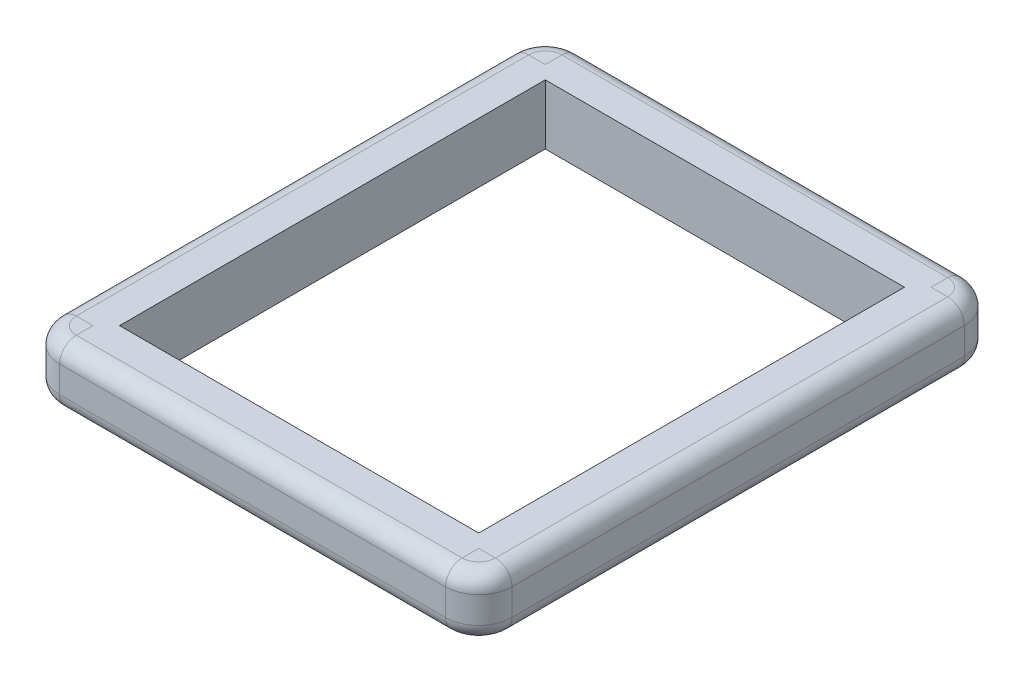
ISO-10303-21;
HEADER;
FILE_DESCRIPTION(('STEP AP214'),'2;1');
FILE_NAME('part.step','',(''),(''),'','','');
FILE_SCHEMA(('AUTOMOTIVE_DESIGN { 1 0 10303 214 1 1 1 1 }'));
ENDSEC;
DATA;
#1=APPLICATION_CONTEXT('core data for automotive mechanical design processes');
#2=APPLICATION_PROTOCOL_DEFINITION('international standard','automotive_design',2000,#1);
#3=PRODUCT_CONTEXT('',#1,'mechanical');
#4=PRODUCT('Part','Part','',(#3));
#5=PRODUCT_RELATED_PRODUCT_CATEGORY('part','',(#4));
#6=PRODUCT_DEFINITION_FORMATION('','',#4);
#7=PRODUCT_DEFINITION_CONTEXT('part definition',#1,'design');
#8=PRODUCT_DEFINITION('design','',#6,#7);
#9=PRODUCT_DEFINITION_SHAPE('','',#8);
#10=(LENGTH_UNIT() NAMED_UNIT(*) SI_UNIT(.MILLI.,.METRE.));
#11=(NAMED_UNIT(*) PLANE_ANGLE_UNIT() SI_UNIT($,.RADIAN.));
#12=(NAMED_UNIT(*) SI_UNIT($,.STERADIAN.) SOLID_ANGLE_UNIT());
#13=UNCERTAINTY_MEASURE_WITH_UNIT(LENGTH_MEASURE(1.E-05),#10,'distance_accuracy_value','');
#14=(GEOMETRIC_REPRESENTATION_CONTEXT(3) GLOBAL_UNCERTAINTY_ASSIGNED_CONTEXT((#13)) GLOBAL_UNIT_ASSIGNED_CONTEXT((#10,
#11,#12)) REPRESENTATION_CONTEXT('',''));
#15=CARTESIAN_POINT('',(0.,0.,0.));
#16=DIRECTION('',(0.,0.,1.));
#17=DIRECTION('',(1.,0.,0.));
#18=AXIS2_PLACEMENT_3D('',#15,#16,#17);
#19=CARTESIAN_POINT('',(0.,152.4,0.));
#20=DIRECTION('',(0.,-1.,0.));
#21=DIRECTION('',(0.,0.,-1.));
#22=AXIS2_PLACEMENT_3D('',#19,#20,#21);
#23=PLANE('',#22);
#24=DIRECTION('',(1.,0.,0.));
#25=VECTOR('',#24,1.);
#26=CARTESIAN_POINT('',(-400000.,152.4,-406.399999999962));
#27=LINE('',#26,#25);
#28=CARTESIAN_POINT('',(-342.899999999986,152.4,-406.400000000027));
#29=VERTEX_POINT('',#28);
#30=CARTESIAN_POINT('',(342.899999999986,152.4,-406.400000000027));
#31=VERTEX_POINT('',#30);
#32=EDGE_CURVE('E276',#29,#31,#27,.T.);
#33=ORIENTED_EDGE('',*,*,#32,.T.);
#34=DIRECTION('',(0.,0.,1.));
#35=VECTOR('',#34,1.);
#36=CARTESIAN_POINT('',(342.900000000043,152.4,291051.6775));
#37=LINE('',#36,#35);
#38=CARTESIAN_POINT('',(342.899999999986,152.4,406.400000000011));
#39=VERTEX_POINT('',#38);
#40=EDGE_CURVE('E265',#31,#39,#37,.T.);
#41=ORIENTED_EDGE('',*,*,#40,.T.);
#42=DIRECTION('',(-1.,0.,0.));
#43=VECTOR('',#42,1.);
#44=CARTESIAN_POINT('',(-400000.,152.4,406.400000000076));
#45=LINE('',#44,#43);
#46=CARTESIAN_POINT('',(-342.899999999969,152.4,406.400000000011));
#47=VERTEX_POINT('',#46);
#48=EDGE_CURVE('E269',#39,#47,#45,.T.);
#49=ORIENTED_EDGE('',*,*,#48,.T.);
#50=DIRECTION('',(0.,0.,-1.));
#51=VECTOR('',#50,1.);
#52=CARTESIAN_POINT('',(-342.899999999929,152.4,291051.6775));
#53=LINE('',#52,#51);
#54=EDGE_CURVE('E59',#47,#29,#53,.T.);
#55=ORIENTED_EDGE('',*,*,#54,.T.);
#56=EDGE_LOOP('',(#33,#41,#49,#55));
#57=FACE_BOUND('',#56,.T.);
#58=DIRECTION('',(0.,0.,-1.));
#59=VECTOR('',#58,1.);
#60=CARTESIAN_POINT('',(-368.299999999976,152.4,-463.550000000013));
#61=LINE('',#60,#59);
#62=CARTESIAN_POINT('',(-368.299999999977,152.4,-431.800000000013));
#63=VERTEX_POINT('',#62);
#64=CARTESIAN_POINT('',(-368.299999999976,152.4,-463.550000000013));
#65=VERTEX_POINT('',#64);
#66=EDGE_CURVE('E226',#63,#65,#61,.T.);
#67=ORIENTED_EDGE('',*,*,#66,.F.);
#68=DIRECTION('',(-1.,0.,0.));
#69=VECTOR('',#68,1.);
#70=CARTESIAN_POINT('',(-400.049999999976,152.4,-431.800000000013));
#71=LINE('',#70,#69);
#72=CARTESIAN_POINT('',(-400.049999999976,152.4,-431.800000000013));
#73=VERTEX_POINT('',#72);
#74=EDGE_CURVE('E722',#63,#73,#71,.T.);
#75=ORIENTED_EDGE('',*,*,#74,.T.);
#76=DIRECTION('',(0.,0.,-1.));
#77=VECTOR('',#76,1.);
#78=CARTESIAN_POINT('',(-400.049999999977,152.4,431.800000000006));
#79=LINE('',#78,#77);
#80=CARTESIAN_POINT('',(-400.049999999977,152.4,431.800000000006));
#81=VERTEX_POINT('',#80);
#82=EDGE_CURVE('E736',#81,#73,#79,.T.);
#83=ORIENTED_EDGE('',*,*,#82,.F.);
#84=DIRECTION('',(-1.,0.,0.));
#85=VECTOR('',#84,1.);
#86=CARTESIAN_POINT('',(-400.049999999977,152.4,431.800000000006));
#87=LINE('',#86,#85);
#88=CARTESIAN_POINT('',(-368.299999999977,152.4,431.800000000006));
#89=VERTEX_POINT('',#88);
#90=EDGE_CURVE('E877',#89,#81,#87,.T.);
#91=ORIENTED_EDGE('',*,*,#90,.F.);
#92=DIRECTION('',(0.,0.,1.));
#93=VECTOR('',#92,1.);
#94=CARTESIAN_POINT('',(-368.299999999977,152.4,463.550000000006));
#95=LINE('',#94,#93);
#96=CARTESIAN_POINT('',(-368.299999999977,152.4,463.550000000006));
#97=VERTEX_POINT('',#96);
#98=EDGE_CURVE('E258',#89,#97,#95,.T.);
#99=ORIENTED_EDGE('',*,*,#98,.T.);
#100=DIRECTION('',(-1.,0.,0.));
#101=VECTOR('',#100,1.);
#102=CARTESIAN_POINT('',(368.299999999976,152.4,463.550000000006));
#103=LINE('',#102,#101);
#104=CARTESIAN_POINT('',(368.299999999976,152.4,463.550000000006));
#105=VERTEX_POINT('',#104);
#106=EDGE_CURVE('E783',#105,#97,#103,.T.);
#107=ORIENTED_EDGE('',*,*,#106,.F.);
#108=DIRECTION('',(0.,0.,1.));
#109=VECTOR('',#108,1.);
#110=CARTESIAN_POINT('',(368.299999999976,152.4,463.550000000006));
#111=LINE('',#110,#109);
#112=CARTESIAN_POINT('',(368.299999999977,152.4,431.800000000006));
#113=VERTEX_POINT('',#112);
#114=EDGE_CURVE('E253',#113,#105,#111,.T.);
#115=ORIENTED_EDGE('',*,*,#114,.F.);
#116=DIRECTION('',(1.,0.,0.));
#117=VECTOR('',#116,1.);
#118=CARTESIAN_POINT('',(400.049999999976,152.4,431.800000000007));
#119=LINE('',#118,#117);
#120=CARTESIAN_POINT('',(400.049999999967,152.4,431.800000000007));
#121=VERTEX_POINT('',#120);
#122=EDGE_CURVE('E249',#113,#121,#119,.T.);
#123=ORIENTED_EDGE('',*,*,#122,.T.);
#124=DIRECTION('',(0.,0.,1.));
#125=VECTOR('',#124,1.);
#126=CARTESIAN_POINT('',(400.049999999986,152.4,-431.799999999997));
#127=LINE('',#126,#125);
#128=CARTESIAN_POINT('',(400.049999999996,152.4,-431.799999999997));
#129=VERTEX_POINT('',#128);
#130=EDGE_CURVE('E768',#129,#121,#127,.T.);
#131=ORIENTED_EDGE('',*,*,#130,.F.);
#132=DIRECTION('',(1.,0.,0.));
#133=VECTOR('',#132,1.);
#134=CARTESIAN_POINT('',(400.049999999986,152.4,-431.799999999997));
#135=LINE('',#134,#133);
#136=CARTESIAN_POINT('',(368.299999999996,152.4,-431.80000000001));
#137=VERTEX_POINT('',#136);
#138=EDGE_CURVE('E244',#137,#129,#135,.T.);
#139=ORIENTED_EDGE('',*,*,#138,.F.);
#140=DIRECTION('',(0.,0.,-1.));
#141=VECTOR('',#140,1.);
#142=CARTESIAN_POINT('',(368.299999999996,152.4,-463.55000000001));
#143=LINE('',#142,#141);
#144=CARTESIAN_POINT('',(368.299999999996,152.4,-463.55000000001));
#145=VERTEX_POINT('',#144);
#146=EDGE_CURVE('E232',#137,#145,#143,.T.);
#147=ORIENTED_EDGE('',*,*,#146,.T.);
#148=DIRECTION('',(1.,0.,0.));
#149=VECTOR('',#148,1.);
#150=CARTESIAN_POINT('',(-368.299999999976,152.4,-463.550000000013));
#151=LINE('',#150,#149);
#152=EDGE_CURVE('E235',#65,#145,#151,.T.);
#153=ORIENTED_EDGE('',*,*,#152,.F.);
#154=EDGE_LOOP('',(#67,#75,#83,#91,#99,#107,#115,#123,#131,#139,#147,#153));
#155=FACE_BOUND('',#154,.T.);
#156=ADVANCED_FACE('F42',(#57,#155),#23,.F.);
#157=CARTESIAN_POINT('',(0.,38.1,0.));
#158=DIRECTION('',(0.,-1.,0.));
#159=DIRECTION('',(0.,0.,-1.));
#160=AXIS2_PLACEMENT_3D('',#157,#158,#159);
#161=PLANE('',#160);
#162=DIRECTION('',(0.,0.,1.));
#163=VECTOR('',#162,1.);
#164=CARTESIAN_POINT('',(342.900000000043,38.1,291051.6775));
#165=LINE('',#164,#163);
#166=CARTESIAN_POINT('',(342.899999999986,38.1,-406.400000000027));
#167=VERTEX_POINT('',#166);
#168=CARTESIAN_POINT('',(342.899999999986,38.1,406.400000000011));
#169=VERTEX_POINT('',#168);
#170=EDGE_CURVE('E66',#167,#169,#165,.T.);
#171=ORIENTED_EDGE('',*,*,#170,.F.);
#172=DIRECTION('',(1.,0.,0.));
#173=VECTOR('',#172,1.);
#174=CARTESIAN_POINT('',(-400000.,38.1,-406.399999999962));
#175=LINE('',#174,#173);
#176=CARTESIAN_POINT('',(-342.899999999986,38.1,-406.400000000027));
#177=VERTEX_POINT('',#176);
#178=EDGE_CURVE('E270',#177,#167,#175,.T.);
#179=ORIENTED_EDGE('',*,*,#178,.F.);
#180=DIRECTION('',(0.,0.,-1.));
#181=VECTOR('',#180,1.);
#182=CARTESIAN_POINT('',(-342.899999999929,38.1,291051.6775));
#183=LINE('',#182,#181);
#184=CARTESIAN_POINT('',(-342.899999999969,38.1,406.400000000019));
#185=VERTEX_POINT('',#184);
#186=EDGE_CURVE('E287',#185,#177,#183,.T.);
#187=ORIENTED_EDGE('',*,*,#186,.F.);
#188=DIRECTION('',(-1.,0.,0.));
#189=VECTOR('',#188,1.);
#190=CARTESIAN_POINT('',(-400000.,38.1,406.400000000076));
#191=LINE('',#190,#189);
#192=EDGE_CURVE('E282',#169,#185,#191,.T.);
#193=ORIENTED_EDGE('',*,*,#192,.F.);
#194=EDGE_LOOP('',(#171,#179,#187,#193));
#195=FACE_BOUND('',#194,.T.);
#196=DIRECTION('',(0.,0.,-1.));
#197=VECTOR('',#196,1.);
#198=CARTESIAN_POINT('',(-368.299999999977,38.1,431.800000000006));
#199=LINE('',#198,#197);
#200=CARTESIAN_POINT('',(-368.299999999977,38.1,463.550000000006));
#201=VERTEX_POINT('',#200);
#202=CARTESIAN_POINT('',(-368.299999999977,38.1,431.800000000006));
#203=VERTEX_POINT('',#202);
#204=EDGE_CURVE('E260',#201,#203,#199,.T.);
#205=ORIENTED_EDGE('',*,*,#204,.T.);
#206=DIRECTION('',(1.,0.,0.));
#207=VECTOR('',#206,1.);
#208=CARTESIAN_POINT('',(-368.299999999977,38.1,431.800000000006));
#209=LINE('',#208,#207);
#210=CARTESIAN_POINT('',(-400.049999999977,38.1,431.800000000006));
#211=VERTEX_POINT('',#210);
#212=EDGE_CURVE('E844',#211,#203,#209,.T.);
#213=ORIENTED_EDGE('',*,*,#212,.F.);
#214=DIRECTION('',(0.,0.,-1.));
#215=VECTOR('',#214,1.);
#216=CARTESIAN_POINT('',(-400.049999999977,38.1,431.800000000006));
#217=LINE('',#216,#215);
#218=CARTESIAN_POINT('',(-400.049999999976,38.1,-431.800000000013));
#219=VERTEX_POINT('',#218);
#220=EDGE_CURVE('E222',#211,#219,#217,.T.);
#221=ORIENTED_EDGE('',*,*,#220,.T.);
#222=DIRECTION('',(1.,0.,0.));
#223=VECTOR('',#222,1.);
#224=CARTESIAN_POINT('',(-368.299999999976,38.1,-431.800000000013));
#225=LINE('',#224,#223);
#226=CARTESIAN_POINT('',(-368.299999999976,38.1,-431.800000000013));
#227=VERTEX_POINT('',#226);
#228=EDGE_CURVE('E217',#219,#227,#225,.T.);
#229=ORIENTED_EDGE('',*,*,#228,.T.);
#230=DIRECTION('',(0.,0.,1.));
#231=VECTOR('',#230,1.);
#232=CARTESIAN_POINT('',(-368.299999999976,38.1,-431.800000000013));
#233=LINE('',#232,#231);
#234=CARTESIAN_POINT('',(-368.299999999976,38.1,-463.550000000013));
#235=VERTEX_POINT('',#234);
#236=EDGE_CURVE('E220',#235,#227,#233,.T.);
#237=ORIENTED_EDGE('',*,*,#236,.F.);
#238=DIRECTION('',(1.,0.,0.));
#239=VECTOR('',#238,1.);
#240=CARTESIAN_POINT('',(-368.299999999976,38.1,-463.550000000013));
#241=LINE('',#240,#239);
#242=CARTESIAN_POINT('',(368.299999999996,38.1,-463.55000000001));
#243=VERTEX_POINT('',#242);
#244=EDGE_CURVE('E245',#235,#243,#241,.T.);
#245=ORIENTED_EDGE('',*,*,#244,.T.);
#246=DIRECTION('',(0.,0.,1.));
#247=VECTOR('',#246,1.);
#248=CARTESIAN_POINT('',(368.299999999996,38.1,-431.80000000001));
#249=LINE('',#248,#247);
#250=CARTESIAN_POINT('',(368.299999999996,38.1,-431.80000000001));
#251=VERTEX_POINT('',#250);
#252=EDGE_CURVE('E242',#243,#251,#249,.T.);
#253=ORIENTED_EDGE('',*,*,#252,.T.);
#254=DIRECTION('',(-1.,0.,0.));
#255=VECTOR('',#254,1.);
#256=CARTESIAN_POINT('',(368.299999999986,38.1,-431.799999999998));
#257=LINE('',#256,#255);
#258=CARTESIAN_POINT('',(400.049999999996,38.1,-431.799999999997));
#259=VERTEX_POINT('',#258);
#260=EDGE_CURVE('E246',#259,#251,#257,.T.);
#261=ORIENTED_EDGE('',*,*,#260,.F.);
#262=DIRECTION('',(0.,0.,1.));
#263=VECTOR('',#262,1.);
#264=CARTESIAN_POINT('',(400.049999999986,38.1,-431.799999999997));
#265=LINE('',#264,#263);
#266=CARTESIAN_POINT('',(400.049999999967,38.1,431.800000000007));
#267=VERTEX_POINT('',#266);
#268=EDGE_CURVE('E254',#259,#267,#265,.T.);
#269=ORIENTED_EDGE('',*,*,#268,.T.);
#270=DIRECTION('',(-1.,0.,0.));
#271=VECTOR('',#270,1.);
#272=CARTESIAN_POINT('',(368.299999999976,38.1,431.800000000006));
#273=LINE('',#272,#271);
#274=CARTESIAN_POINT('',(368.299999999976,38.1,431.800000000006));
#275=VERTEX_POINT('',#274);
#276=EDGE_CURVE('E251',#267,#275,#273,.T.);
#277=ORIENTED_EDGE('',*,*,#276,.T.);
#278=DIRECTION('',(0.,0.,-1.));
#279=VECTOR('',#278,1.);
#280=CARTESIAN_POINT('',(368.299999999976,38.1,431.800000000006));
#281=LINE('',#280,#279);
#282=CARTESIAN_POINT('',(368.299999999976,38.1,463.550000000006));
#283=VERTEX_POINT('',#282);
#284=EDGE_CURVE('E255',#283,#275,#281,.T.);
#285=ORIENTED_EDGE('',*,*,#284,.F.);
#286=DIRECTION('',(-1.,0.,0.));
#287=VECTOR('',#286,1.);
#288=CARTESIAN_POINT('',(368.299999999976,38.1,463.550000000006));
#289=LINE('',#288,#287);
#290=EDGE_CURVE('E264',#283,#201,#289,.T.);
#291=ORIENTED_EDGE('',*,*,#290,.T.);
#292=EDGE_LOOP('',(#205,#213,#221,#229,#237,#245,#253,#261,#269,#277,#285,#291));
#293=FACE_BOUND('',#292,.T.);
#294=ADVANCED_FACE('F44',(#195,#293),#161,.T.);
#295=CARTESIAN_POINT('',(342.900000000043,152.4,291051.6775));
#296=DIRECTION('',(1.,0.,0.));
#297=DIRECTION('',(0.,0.,-1.));
#298=AXIS2_PLACEMENT_3D('',#295,#296,#297);
#299=PLANE('',#298);
#300=ORIENTED_EDGE('',*,*,#170,.T.);
#301=DIRECTION('',(0.,-1.,0.));
#302=VECTOR('',#301,1.);
#303=CARTESIAN_POINT('',(342.899999999986,152.4,406.400000000011));
#304=LINE('',#303,#302);
#305=EDGE_CURVE('E46',#39,#169,#304,.T.);
#306=ORIENTED_EDGE('',*,*,#305,.F.);
#307=ORIENTED_EDGE('',*,*,#40,.F.);
#308=DIRECTION('',(0.,-1.,0.));
#309=VECTOR('',#308,1.);
#310=CARTESIAN_POINT('',(342.899999999986,152.4,-406.400000000027));
#311=LINE('',#310,#309);
#312=EDGE_CURVE('E11',#31,#167,#311,.T.);
#313=ORIENTED_EDGE('',*,*,#312,.T.);
#314=EDGE_LOOP('',(#300,#306,#307,#313));
#315=FACE_BOUND('',#314,.T.);
#316=ADVANCED_FACE('F312',(#315),#299,.F.);
#317=CARTESIAN_POINT('',(-400000.,152.4,-406.399999999962));
#318=DIRECTION('',(0.,0.,-1.));
#319=DIRECTION('',(-1.,0.,0.));
#320=AXIS2_PLACEMENT_3D('',#317,#318,#319);
#321=PLANE('',#320);
#322=ORIENTED_EDGE('',*,*,#178,.T.);
#323=ORIENTED_EDGE('',*,*,#312,.F.);
#324=ORIENTED_EDGE('',*,*,#32,.F.);
#325=DIRECTION('',(0.,-1.,0.));
#326=VECTOR('',#325,1.);
#327=CARTESIAN_POINT('',(-342.899999999986,152.4,-406.400000000027));
#328=LINE('',#327,#326);
#329=EDGE_CURVE('E51',#29,#177,#328,.T.);
#330=ORIENTED_EDGE('',*,*,#329,.T.);
#331=EDGE_LOOP('',(#322,#323,#324,#330));
#332=FACE_BOUND('',#331,.T.);
#333=ADVANCED_FACE('F309',(#332),#321,.F.);
#334=CARTESIAN_POINT('',(-342.899999999929,152.4,291051.6775));
#335=DIRECTION('',(-1.,0.,0.));
#336=DIRECTION('',(0.,0.,1.));
#337=AXIS2_PLACEMENT_3D('',#334,#335,#336);
#338=PLANE('',#337);
#339=ORIENTED_EDGE('',*,*,#186,.T.);
#340=ORIENTED_EDGE('',*,*,#329,.F.);
#341=ORIENTED_EDGE('',*,*,#54,.F.);
#342=DIRECTION('',(0.,-1.,0.));
#343=VECTOR('',#342,1.);
#344=CARTESIAN_POINT('',(-342.899999999969,152.4,406.400000000019));
#345=LINE('',#344,#343);
#346=EDGE_CURVE('E295',#47,#185,#345,.T.);
#347=ORIENTED_EDGE('',*,*,#346,.T.);
#348=EDGE_LOOP('',(#339,#340,#341,#347));
#349=FACE_BOUND('',#348,.T.);
#350=ADVANCED_FACE('F306',(#349),#338,.F.);
#351=CARTESIAN_POINT('',(-400000.,152.4,406.400000000076));
#352=DIRECTION('',(0.,0.,1.));
#353=DIRECTION('',(1.,0.,0.));
#354=AXIS2_PLACEMENT_3D('',#351,#352,#353);
#355=PLANE('',#354);
#356=ORIENTED_EDGE('',*,*,#192,.T.);
#357=ORIENTED_EDGE('',*,*,#346,.F.);
#358=ORIENTED_EDGE('',*,*,#48,.F.);
#359=ORIENTED_EDGE('',*,*,#305,.T.);
#360=EDGE_LOOP('',(#356,#357,#358,#359));
#361=FACE_BOUND('',#360,.T.);
#362=ADVANCED_FACE('F301',(#361),#355,.F.);
#363=CARTESIAN_POINT('',(-400.049999999977,120.65,431.800000000006));
#364=DIRECTION('',(0.,0.,-1.));
#365=DIRECTION('',(-1.,0.,0.));
#366=AXIS2_PLACEMENT_3D('',#363,#364,#365);
#367=CYLINDRICAL_SURFACE('',#366,31.75);
#368=DIRECTION('',(0.,0.,-1.));
#369=VECTOR('',#368,1.);
#370=CARTESIAN_POINT('',(-431.799999999977,120.65,431.800000000006));
#371=LINE('',#370,#369);
#372=CARTESIAN_POINT('',(-431.799999999977,120.65,431.800000000006));
#373=VERTEX_POINT('',#372);
#374=CARTESIAN_POINT('',(-431.799999999976,120.65,-431.800000000013));
#375=VERTEX_POINT('',#374);
#376=EDGE_CURVE('E735',#373,#375,#371,.T.);
#377=ORIENTED_EDGE('',*,*,#376,.F.);
#378=CARTESIAN_POINT('',(-400.049999999977,120.65,431.800000000006));
#379=DIRECTION('',(0.,0.,1.));
#380=DIRECTION('',(1.,0.,0.));
#381=AXIS2_PLACEMENT_3D('',#378,#379,#380);
#382=CIRCLE('',#381,31.75);
#383=EDGE_CURVE('E744',#81,#373,#382,.T.);
#384=ORIENTED_EDGE('',*,*,#383,.F.);
#385=ORIENTED_EDGE('',*,*,#82,.T.);
#386=CARTESIAN_POINT('',(-400.049999999976,120.65,-431.800000000013));
#387=DIRECTION('',(0.,0.,1.));
#388=DIRECTION('',(1.,0.,0.));
#389=AXIS2_PLACEMENT_3D('',#386,#387,#388);
#390=CIRCLE('',#389,31.75);
#391=EDGE_CURVE('E731',#73,#375,#390,.T.);
#392=ORIENTED_EDGE('',*,*,#391,.T.);
#393=EDGE_LOOP('',(#377,#384,#385,#392));
#394=FACE_BOUND('',#393,.T.);
#395=ADVANCED_FACE('F390',(#394),#367,.T.);
#396=CARTESIAN_POINT('',(-431.799999999977,120.65,431.800000000006));
#397=DIRECTION('',(1.,0.,0.));
#398=DIRECTION('',(0.,0.,-1.));
#399=AXIS2_PLACEMENT_3D('',#396,#397,#398);
#400=PLANE('',#399);
#401=DIRECTION('',(0.,0.,-1.));
#402=VECTOR('',#401,1.);
#403=CARTESIAN_POINT('',(-431.799999999977,69.85,431.800000000006));
#404=LINE('',#403,#402);
#405=CARTESIAN_POINT('',(-431.799999999977,69.85,431.800000000006));
#406=VERTEX_POINT('',#405);
#407=CARTESIAN_POINT('',(-431.799999999976,69.85,-431.800000000013));
#408=VERTEX_POINT('',#407);
#409=EDGE_CURVE('E799',#406,#408,#404,.T.);
#410=ORIENTED_EDGE('',*,*,#409,.F.);
#411=DIRECTION('',(0.,-1.,0.));
#412=VECTOR('',#411,1.);
#413=CARTESIAN_POINT('',(-431.799999999977,120.65,431.800000000006));
#414=LINE('',#413,#412);
#415=EDGE_CURVE('E792',#373,#406,#414,.T.);
#416=ORIENTED_EDGE('',*,*,#415,.F.);
#417=ORIENTED_EDGE('',*,*,#376,.T.);
#418=DIRECTION('',(0.,-1.,0.));
#419=VECTOR('',#418,1.);
#420=CARTESIAN_POINT('',(-431.799999999976,120.65,-431.800000000013));
#421=LINE('',#420,#419);
#422=EDGE_CURVE('E740',#375,#408,#421,.T.);
#423=ORIENTED_EDGE('',*,*,#422,.T.);
#424=EDGE_LOOP('',(#410,#416,#417,#423));
#425=FACE_BOUND('',#424,.T.);
#426=ADVANCED_FACE('F393',(#425),#400,.F.);
#427=CARTESIAN_POINT('',(-400.049999999977,69.85,431.800000000006));
#428=DIRECTION('',(0.,0.,-1.));
#429=DIRECTION('',(-1.,0.,0.));
#430=AXIS2_PLACEMENT_3D('',#427,#428,#429);
#431=CYLINDRICAL_SURFACE('',#430,31.75);
#432=ORIENTED_EDGE('',*,*,#220,.F.);
#433=CARTESIAN_POINT('',(-400.049999999977,69.85,431.800000000006));
#434=DIRECTION('',(0.,0.,1.));
#435=DIRECTION('',(1.,0.,0.));
#436=AXIS2_PLACEMENT_3D('',#433,#434,#435);
#437=CIRCLE('',#436,31.75);
#438=EDGE_CURVE('E796',#406,#211,#437,.T.);
#439=ORIENTED_EDGE('',*,*,#438,.F.);
#440=ORIENTED_EDGE('',*,*,#409,.T.);
#441=CARTESIAN_POINT('',(-400.049999999976,69.85,-431.800000000013));
#442=DIRECTION('',(0.,0.,1.));
#443=DIRECTION('',(1.,0.,0.));
#444=AXIS2_PLACEMENT_3D('',#441,#442,#443);
#445=CIRCLE('',#444,31.75);
#446=EDGE_CURVE('E802',#408,#219,#445,.T.);
#447=ORIENTED_EDGE('',*,*,#446,.T.);
#448=EDGE_LOOP('',(#432,#439,#440,#447));
#449=FACE_BOUND('',#448,.T.);
#450=ADVANCED_FACE('F400',(#449),#431,.T.);
#451=CARTESIAN_POINT('',(-400.049999999976,152.4,-431.800000000013));
#452=DIRECTION('',(0.,-1.,0.));
#453=DIRECTION('',(0.,0.,-1.));
#454=AXIS2_PLACEMENT_3D('',#451,#452,#453);
#455=PLANE('',#454);
#456=CARTESIAN_POINT('',(-368.299999999977,152.4,-431.800000000013));
#457=DIRECTION('',(0.,-1.,0.));
#458=DIRECTION('',(-1.,0.,0.));
#459=AXIS2_PLACEMENT_3D('',#456,#457,#458);
#460=CIRCLE('',#459,31.7499999999999);
#461=EDGE_CURVE('E719',#73,#65,#460,.T.);
#462=ORIENTED_EDGE('',*,*,#461,.F.);
#463=ORIENTED_EDGE('',*,*,#74,.F.);
#464=ORIENTED_EDGE('',*,*,#66,.T.);
#465=EDGE_LOOP('',(#462,#463,#464));
#466=FACE_BOUND('',#465,.T.);
#467=ADVANCED_FACE('F408',(#466),#455,.F.);
#468=CARTESIAN_POINT('',(-368.299999999977,120.65,-431.800000000013));
#469=DIRECTION('',(0.,-1.,0.));
#470=DIRECTION('',(0.,0.,-1.));
#471=AXIS2_PLACEMENT_3D('',#468,#469,#470);
#472=DEGENERATE_TOROIDAL_SURFACE('',#471,31.7499999999999,31.75,.T.);
#473=CARTESIAN_POINT('',(-368.299999999977,120.65,-431.800000000013));
#474=DIRECTION('',(0.,-1.,0.));
#475=DIRECTION('',(-1.,0.,0.));
#476=AXIS2_PLACEMENT_3D('',#473,#474,#475);
#477=CIRCLE('',#476,63.4999999999999);
#478=CARTESIAN_POINT('',(-368.299999999976,120.65,-495.300000000013));
#479=VERTEX_POINT('',#478);
#480=EDGE_CURVE('E732',#375,#479,#477,.T.);
#481=ORIENTED_EDGE('',*,*,#480,.F.);
#482=ORIENTED_EDGE('',*,*,#391,.F.);
#483=ORIENTED_EDGE('',*,*,#461,.T.);
#484=CARTESIAN_POINT('',(-368.299999999976,120.65,-463.550000000013));
#485=DIRECTION('',(-1.,0.,0.));
#486=DIRECTION('',(0.,0.,1.));
#487=AXIS2_PLACEMENT_3D('',#484,#485,#486);
#488=CIRCLE('',#487,31.75);
#489=EDGE_CURVE('E727',#65,#479,#488,.T.);
#490=ORIENTED_EDGE('',*,*,#489,.T.);
#491=EDGE_LOOP('',(#481,#482,#483,#490));
#492=FACE_BOUND('',#491,.T.);
#493=ADVANCED_FACE('F452',(#492),#472,.T.);
#494=CARTESIAN_POINT('',(-368.299999999977,152.4,-431.800000000013));
#495=DIRECTION('',(0.,-1.,0.));
#496=DIRECTION('',(0.,0.,-1.));
#497=AXIS2_PLACEMENT_3D('',#494,#495,#496);
#498=CYLINDRICAL_SURFACE('',#497,63.4999999999999);
#499=CARTESIAN_POINT('',(-368.299999999977,69.85,-431.800000000013));
#500=DIRECTION('',(0.,-1.,0.));
#501=DIRECTION('',(-1.,0.,0.));
#502=AXIS2_PLACEMENT_3D('',#499,#500,#501);
#503=CIRCLE('',#502,63.4999999999999);
#504=CARTESIAN_POINT('',(-368.299999999976,69.85,-495.300000000013));
#505=VERTEX_POINT('',#504);
#506=EDGE_CURVE('E806',#408,#505,#503,.T.);
#507=ORIENTED_EDGE('',*,*,#506,.F.);
#508=ORIENTED_EDGE('',*,*,#422,.F.);
#509=ORIENTED_EDGE('',*,*,#480,.T.);
#510=DIRECTION('',(0.,-1.,0.));
#511=VECTOR('',#510,1.);
#512=CARTESIAN_POINT('',(-368.299999999976,120.65,-495.300000000013));
#513=LINE('',#512,#511);
#514=EDGE_CURVE('E749',#479,#505,#513,.T.);
#515=ORIENTED_EDGE('',*,*,#514,.T.);
#516=EDGE_LOOP('',(#507,#508,#509,#515));
#517=FACE_BOUND('',#516,.T.);
#518=ADVANCED_FACE('F447',(#517),#498,.T.);
#519=CARTESIAN_POINT('',(-368.299999999977,69.85,-431.800000000013));
#520=DIRECTION('',(0.,-1.,0.));
#521=DIRECTION('',(0.,0.,-1.));
#522=AXIS2_PLACEMENT_3D('',#519,#520,#521);
#523=DEGENERATE_TOROIDAL_SURFACE('',#522,31.7499999999999,31.75,.T.);
#524=CARTESIAN_POINT('',(-368.299999999977,38.1,-431.800000000013));
#525=DIRECTION('',(0.,-1.,0.));
#526=DIRECTION('',(-1.,0.,0.));
#527=AXIS2_PLACEMENT_3D('',#524,#525,#526);
#528=CIRCLE('',#527,31.7499999999999);
#529=EDGE_CURVE('E230',#219,#235,#528,.T.);
#530=ORIENTED_EDGE('',*,*,#529,.F.);
#531=ORIENTED_EDGE('',*,*,#446,.F.);
#532=ORIENTED_EDGE('',*,*,#506,.T.);
#533=CARTESIAN_POINT('',(-368.299999999976,69.85,-463.550000000013));
#534=DIRECTION('',(-1.,0.,0.));
#535=DIRECTION('',(0.,0.,1.));
#536=AXIS2_PLACEMENT_3D('',#533,#534,#535);
#537=CIRCLE('',#536,31.75);
#538=EDGE_CURVE('E238',#505,#235,#537,.T.);
#539=ORIENTED_EDGE('',*,*,#538,.T.);
#540=EDGE_LOOP('',(#530,#531,#532,#539));
#541=FACE_BOUND('',#540,.T.);
#542=ADVANCED_FACE('F451',(#541),#523,.T.);
#543=CARTESIAN_POINT('',(-368.299999999976,38.1,-431.800000000013));
#544=DIRECTION('',(0.,1.,0.));
#545=DIRECTION('',(0.,0.,1.));
#546=AXIS2_PLACEMENT_3D('',#543,#544,#545);
#547=PLANE('',#546);
#548=ORIENTED_EDGE('',*,*,#236,.T.);
#549=ORIENTED_EDGE('',*,*,#228,.F.);
#550=ORIENTED_EDGE('',*,*,#529,.T.);
#551=EDGE_LOOP('',(#548,#549,#550));
#552=FACE_BOUND('',#551,.T.);
#553=ADVANCED_FACE('F228',(#552),#547,.F.);
#554=CARTESIAN_POINT('',(-368.299999999976,120.65,-463.550000000013));
#555=DIRECTION('',(1.,0.,0.));
#556=DIRECTION('',(0.,0.,-1.));
#557=AXIS2_PLACEMENT_3D('',#554,#555,#556);
#558=CYLINDRICAL_SURFACE('',#557,31.75);
#559=DIRECTION('',(1.,0.,0.));
#560=VECTOR('',#559,1.);
#561=CARTESIAN_POINT('',(-368.299999999976,120.65,-495.300000000013));
#562=LINE('',#561,#560);
#563=CARTESIAN_POINT('',(368.299999999996,120.65,-495.30000000001));
#564=VERTEX_POINT('',#563);
#565=EDGE_CURVE('E753',#479,#564,#562,.T.);
#566=ORIENTED_EDGE('',*,*,#565,.F.);
#567=ORIENTED_EDGE('',*,*,#489,.F.);
#568=ORIENTED_EDGE('',*,*,#152,.T.);
#569=CARTESIAN_POINT('',(368.299999999996,120.65,-463.55000000001));
#570=DIRECTION('',(-1.,0.,0.));
#571=DIRECTION('',(0.,0.,1.));
#572=AXIS2_PLACEMENT_3D('',#569,#570,#571);
#573=CIRCLE('',#572,31.75);
#574=EDGE_CURVE('E750',#145,#564,#573,.T.);
#575=ORIENTED_EDGE('',*,*,#574,.T.);
#576=EDGE_LOOP('',(#566,#567,#568,#575));
#577=FACE_BOUND('',#576,.T.);
#578=ADVANCED_FACE('F352',(#577),#558,.T.);
#579=CARTESIAN_POINT('',(-368.299999999976,120.65,-495.300000000013));
#580=DIRECTION('',(0.,0.,1.));
#581=DIRECTION('',(1.,0.,0.));
#582=AXIS2_PLACEMENT_3D('',#579,#580,#581);
#583=PLANE('',#582);
#584=DIRECTION('',(1.,0.,0.));
#585=VECTOR('',#584,1.);
#586=CARTESIAN_POINT('',(-368.299999999976,69.85,-495.300000000013));
#587=LINE('',#586,#585);
#588=CARTESIAN_POINT('',(368.299999999996,69.85,-495.30000000001));
#589=VERTEX_POINT('',#588);
#590=EDGE_CURVE('E811',#505,#589,#587,.T.);
#591=ORIENTED_EDGE('',*,*,#590,.F.);
#592=ORIENTED_EDGE('',*,*,#514,.F.);
#593=ORIENTED_EDGE('',*,*,#565,.T.);
#594=DIRECTION('',(0.,-1.,0.));
#595=VECTOR('',#594,1.);
#596=CARTESIAN_POINT('',(368.299999999996,120.65,-495.30000000001));
#597=LINE('',#596,#595);
#598=EDGE_CURVE('E756',#564,#589,#597,.T.);
#599=ORIENTED_EDGE('',*,*,#598,.T.);
#600=EDGE_LOOP('',(#591,#592,#593,#599));
#601=FACE_BOUND('',#600,.T.);
#602=ADVANCED_FACE('F347',(#601),#583,.F.);
#603=CARTESIAN_POINT('',(-368.299999999976,69.85,-463.550000000013));
#604=DIRECTION('',(1.,0.,0.));
#605=DIRECTION('',(0.,0.,-1.));
#606=AXIS2_PLACEMENT_3D('',#603,#604,#605);
#607=CYLINDRICAL_SURFACE('',#606,31.75);
#608=ORIENTED_EDGE('',*,*,#244,.F.);
#609=ORIENTED_EDGE('',*,*,#538,.F.);
#610=ORIENTED_EDGE('',*,*,#590,.T.);
#611=CARTESIAN_POINT('',(368.299999999996,69.85,-463.55000000001));
#612=DIRECTION('',(-1.,0.,0.));
#613=DIRECTION('',(0.,0.,1.));
#614=AXIS2_PLACEMENT_3D('',#611,#612,#613);
#615=CIRCLE('',#614,31.75);
#616=EDGE_CURVE('E814',#589,#243,#615,.T.);
#617=ORIENTED_EDGE('',*,*,#616,.T.);
#618=EDGE_LOOP('',(#608,#609,#610,#617));
#619=FACE_BOUND('',#618,.T.);
#620=ADVANCED_FACE('F351',(#619),#607,.T.);
#621=CARTESIAN_POINT('',(368.299999999996,152.4,-463.55000000001));
#622=DIRECTION('',(0.,-1.,0.));
#623=DIRECTION('',(0.,0.,-1.));
#624=AXIS2_PLACEMENT_3D('',#621,#622,#623);
#625=PLANE('',#624);
#626=CARTESIAN_POINT('',(368.299999999996,152.4,-431.80000000001));
#627=DIRECTION('',(0.,-1.,0.));
#628=DIRECTION('',(0.,0.,-1.));
#629=AXIS2_PLACEMENT_3D('',#626,#627,#628);
#630=CIRCLE('',#629,31.7499999999999);
#631=EDGE_CURVE('E761',#145,#129,#630,.T.);
#632=ORIENTED_EDGE('',*,*,#631,.F.);
#633=ORIENTED_EDGE('',*,*,#146,.F.);
#634=ORIENTED_EDGE('',*,*,#138,.T.);
#635=EDGE_LOOP('',(#632,#633,#634));
#636=FACE_BOUND('',#635,.T.);
#637=ADVANCED_FACE('F420',(#636),#625,.F.);
#638=CARTESIAN_POINT('',(368.299999999996,120.65,-431.80000000001));
#639=DIRECTION('',(0.,-1.,0.));
#640=DIRECTION('',(0.,0.,-1.));
#641=AXIS2_PLACEMENT_3D('',#638,#639,#640);
#642=DEGENERATE_TOROIDAL_SURFACE('',#641,31.7499999999999,31.75,.T.);
#643=CARTESIAN_POINT('',(368.299999999996,120.65,-431.80000000001));
#644=DIRECTION('',(0.,-1.,0.));
#645=DIRECTION('',(0.,0.,-1.));
#646=AXIS2_PLACEMENT_3D('',#643,#644,#645);
#647=CIRCLE('',#646,63.4999999999999);
#648=CARTESIAN_POINT('',(431.799999999996,120.65,-431.799999999997));
#649=VERTEX_POINT('',#648);
#650=EDGE_CURVE('E760',#564,#649,#647,.T.);
#651=ORIENTED_EDGE('',*,*,#650,.F.);
#652=ORIENTED_EDGE('',*,*,#574,.F.);
#653=ORIENTED_EDGE('',*,*,#631,.T.);
#654=CARTESIAN_POINT('',(400.049999999986,120.65,-431.799999999997));
#655=DIRECTION('',(0.,0.,-1.));
#656=DIRECTION('',(-1.,0.,0.));
#657=AXIS2_PLACEMENT_3D('',#654,#655,#656);
#658=CIRCLE('',#657,31.75);
#659=EDGE_CURVE('E757',#129,#649,#658,.T.);
#660=ORIENTED_EDGE('',*,*,#659,.T.);
#661=EDGE_LOOP('',(#651,#652,#653,#660));
#662=FACE_BOUND('',#661,.T.);
#663=ADVANCED_FACE('F621',(#662),#642,.T.);
#664=CARTESIAN_POINT('',(368.299999999996,152.4,-431.80000000001));
#665=DIRECTION('',(0.,-1.,0.));
#666=DIRECTION('',(0.,0.,-1.));
#667=AXIS2_PLACEMENT_3D('',#664,#665,#666);
#668=CYLINDRICAL_SURFACE('',#667,63.4999999999999);
#669=CARTESIAN_POINT('',(368.299999999996,69.85,-431.80000000001));
#670=DIRECTION('',(0.,-1.,0.));
#671=DIRECTION('',(0.,0.,-1.));
#672=AXIS2_PLACEMENT_3D('',#669,#670,#671);
#673=CIRCLE('',#672,63.4999999999999);
#674=CARTESIAN_POINT('',(431.799999999996,69.85,-431.799999999997));
#675=VERTEX_POINT('',#674);
#676=EDGE_CURVE('E817',#589,#675,#673,.T.);
#677=ORIENTED_EDGE('',*,*,#676,.F.);
#678=ORIENTED_EDGE('',*,*,#598,.F.);
#679=ORIENTED_EDGE('',*,*,#650,.T.);
#680=DIRECTION('',(0.,-1.,0.));
#681=VECTOR('',#680,1.);
#682=CARTESIAN_POINT('',(431.799999999986,120.65,-431.799999999997));
#683=LINE('',#682,#681);
#684=EDGE_CURVE('E763',#649,#675,#683,.T.);
#685=ORIENTED_EDGE('',*,*,#684,.T.);
#686=EDGE_LOOP('',(#677,#678,#679,#685));
#687=FACE_BOUND('',#686,.T.);
#688=ADVANCED_FACE('F612',(#687),#668,.T.);
#689=CARTESIAN_POINT('',(368.299999999996,69.85,-431.80000000001));
#690=DIRECTION('',(0.,-1.,0.));
#691=DIRECTION('',(0.,0.,-1.));
#692=AXIS2_PLACEMENT_3D('',#689,#690,#691);
#693=DEGENERATE_TOROIDAL_SURFACE('',#692,31.7499999999999,31.75,.T.);
#694=CARTESIAN_POINT('',(368.299999999996,38.1,-431.80000000001));
#695=DIRECTION('',(0.,-1.,0.));
#696=DIRECTION('',(0.,0.,-1.));
#697=AXIS2_PLACEMENT_3D('',#694,#695,#696);
#698=CIRCLE('',#697,31.7499999999999);
#699=EDGE_CURVE('E250',#243,#259,#698,.T.);
#700=ORIENTED_EDGE('',*,*,#699,.F.);
#701=ORIENTED_EDGE('',*,*,#616,.F.);
#702=ORIENTED_EDGE('',*,*,#676,.T.);
#703=CARTESIAN_POINT('',(400.049999999986,69.85,-431.799999999997));
#704=DIRECTION('',(0.,0.,-1.));
#705=DIRECTION('',(-1.,0.,0.));
#706=AXIS2_PLACEMENT_3D('',#703,#704,#705);
#707=CIRCLE('',#706,31.75);
#708=EDGE_CURVE('E819',#675,#259,#707,.T.);
#709=ORIENTED_EDGE('',*,*,#708,.T.);
#710=EDGE_LOOP('',(#700,#701,#702,#709));
#711=FACE_BOUND('',#710,.T.);
#712=ADVANCED_FACE('F603',(#711),#693,.T.);
#713=CARTESIAN_POINT('',(368.299999999996,38.1,-431.80000000001));
#714=DIRECTION('',(0.,1.,0.));
#715=DIRECTION('',(0.,0.,1.));
#716=AXIS2_PLACEMENT_3D('',#713,#714,#715);
#717=PLANE('',#716);
#718=ORIENTED_EDGE('',*,*,#260,.T.);
#719=ORIENTED_EDGE('',*,*,#252,.F.);
#720=ORIENTED_EDGE('',*,*,#699,.T.);
#721=EDGE_LOOP('',(#718,#719,#720));
#722=FACE_BOUND('',#721,.T.);
#723=ADVANCED_FACE('F375',(#722),#717,.F.);
#724=CARTESIAN_POINT('',(400.049999999986,120.65,-431.799999999997));
#725=DIRECTION('',(0.,0.,1.));
#726=DIRECTION('',(1.,0.,0.));
#727=AXIS2_PLACEMENT_3D('',#724,#725,#726);
#728=CYLINDRICAL_SURFACE('',#727,31.75);
#729=DIRECTION('',(0.,0.,1.));
#730=VECTOR('',#729,1.);
#731=CARTESIAN_POINT('',(431.799999999986,120.65,-431.799999999997));
#732=LINE('',#731,#730);
#733=CARTESIAN_POINT('',(431.799999999967,120.65,431.800000000008));
#734=VERTEX_POINT('',#733);
#735=EDGE_CURVE('E767',#649,#734,#732,.T.);
#736=ORIENTED_EDGE('',*,*,#735,.F.);
#737=ORIENTED_EDGE('',*,*,#659,.F.);
#738=ORIENTED_EDGE('',*,*,#130,.T.);
#739=CARTESIAN_POINT('',(400.049999999976,120.65,431.800000000007));
#740=DIRECTION('',(0.,0.,-1.));
#741=DIRECTION('',(-1.,0.,0.));
#742=AXIS2_PLACEMENT_3D('',#739,#740,#741);
#743=CIRCLE('',#742,31.75);
#744=EDGE_CURVE('E764',#121,#734,#743,.T.);
#745=ORIENTED_EDGE('',*,*,#744,.T.);
#746=EDGE_LOOP('',(#736,#737,#738,#745));
#747=FACE_BOUND('',#746,.T.);
#748=ADVANCED_FACE('F371',(#747),#728,.T.);
#749=CARTESIAN_POINT('',(431.799999999986,120.65,-431.799999999997));
#750=DIRECTION('',(-1.,0.,0.));
#751=DIRECTION('',(0.,0.,1.));
#752=AXIS2_PLACEMENT_3D('',#749,#750,#751);
#753=PLANE('',#752);
#754=DIRECTION('',(0.,0.,1.));
#755=VECTOR('',#754,1.);
#756=CARTESIAN_POINT('',(431.799999999986,69.85,-431.799999999997));
#757=LINE('',#756,#755);
#758=CARTESIAN_POINT('',(431.799999999967,69.85,431.800000000008));
#759=VERTEX_POINT('',#758);
#760=EDGE_CURVE('E822',#675,#759,#757,.T.);
#761=ORIENTED_EDGE('',*,*,#760,.F.);
#762=ORIENTED_EDGE('',*,*,#684,.F.);
#763=ORIENTED_EDGE('',*,*,#735,.T.);
#764=DIRECTION('',(0.,-1.,0.));
#765=VECTOR('',#764,1.);
#766=CARTESIAN_POINT('',(431.799999999976,120.65,431.800000000008));
#767=LINE('',#766,#765);
#768=EDGE_CURVE('E771',#734,#759,#767,.T.);
#769=ORIENTED_EDGE('',*,*,#768,.T.);
#770=EDGE_LOOP('',(#761,#762,#763,#769));
#771=FACE_BOUND('',#770,.T.);
#772=ADVANCED_FACE('F336',(#771),#753,.F.);
#773=CARTESIAN_POINT('',(400.049999999986,69.85,-431.799999999997));
#774=DIRECTION('',(0.,0.,1.));
#775=DIRECTION('',(1.,0.,0.));
#776=AXIS2_PLACEMENT_3D('',#773,#774,#775);
#777=CYLINDRICAL_SURFACE('',#776,31.75);
#778=ORIENTED_EDGE('',*,*,#268,.F.);
#779=ORIENTED_EDGE('',*,*,#708,.F.);
#780=ORIENTED_EDGE('',*,*,#760,.T.);
#781=CARTESIAN_POINT('',(400.049999999976,69.85,431.800000000007));
#782=DIRECTION('',(0.,0.,-1.));
#783=DIRECTION('',(-1.,0.,0.));
#784=AXIS2_PLACEMENT_3D('',#781,#782,#783);
#785=CIRCLE('',#784,31.75);
#786=EDGE_CURVE('E825',#759,#267,#785,.T.);
#787=ORIENTED_EDGE('',*,*,#786,.T.);
#788=EDGE_LOOP('',(#778,#779,#780,#787));
#789=FACE_BOUND('',#788,.T.);
#790=ADVANCED_FACE('F469',(#789),#777,.T.);
#791=CARTESIAN_POINT('',(400.049999999976,152.4,431.800000000007));
#792=DIRECTION('',(0.,-1.,0.));
#793=DIRECTION('',(0.,0.,-1.));
#794=AXIS2_PLACEMENT_3D('',#791,#792,#793);
#795=PLANE('',#794);
#796=CARTESIAN_POINT('',(368.299999999977,152.4,431.800000000006));
#797=DIRECTION('',(0.,-1.,0.));
#798=DIRECTION('',(1.,0.,0.));
#799=AXIS2_PLACEMENT_3D('',#796,#797,#798);
#800=CIRCLE('',#799,31.7499999999999);
#801=EDGE_CURVE('E776',#121,#105,#800,.T.);
#802=ORIENTED_EDGE('',*,*,#801,.F.);
#803=ORIENTED_EDGE('',*,*,#122,.F.);
#804=ORIENTED_EDGE('',*,*,#114,.T.);
#805=EDGE_LOOP('',(#802,#803,#804));
#806=FACE_BOUND('',#805,.T.);
#807=ADVANCED_FACE('F473',(#806),#795,.F.);
#808=CARTESIAN_POINT('',(368.299999999977,120.65,431.800000000006));
#809=DIRECTION('',(0.,-1.,0.));
#810=DIRECTION('',(0.,0.,-1.));
#811=AXIS2_PLACEMENT_3D('',#808,#809,#810);
#812=DEGENERATE_TOROIDAL_SURFACE('',#811,31.7499999999999,31.75,.T.);
#813=CARTESIAN_POINT('',(368.299999999977,120.65,431.800000000006));
#814=DIRECTION('',(0.,-1.,0.));
#815=DIRECTION('',(1.,0.,0.));
#816=AXIS2_PLACEMENT_3D('',#813,#814,#815);
#817=CIRCLE('',#816,63.4999999999999);
#818=CARTESIAN_POINT('',(368.299999999976,120.65,495.300000000006));
#819=VERTEX_POINT('',#818);
#820=EDGE_CURVE('E775',#734,#819,#817,.T.);
#821=ORIENTED_EDGE('',*,*,#820,.F.);
#822=ORIENTED_EDGE('',*,*,#744,.F.);
#823=ORIENTED_EDGE('',*,*,#801,.T.);
#824=CARTESIAN_POINT('',(368.299999999976,120.65,463.550000000006));
#825=DIRECTION('',(1.,0.,0.));
#826=DIRECTION('',(0.,0.,-1.));
#827=AXIS2_PLACEMENT_3D('',#824,#825,#826);
#828=CIRCLE('',#827,31.75);
#829=EDGE_CURVE('E772',#105,#819,#828,.T.);
#830=ORIENTED_EDGE('',*,*,#829,.T.);
#831=EDGE_LOOP('',(#821,#822,#823,#830));
#832=FACE_BOUND('',#831,.T.);
#833=ADVANCED_FACE('F572',(#832),#812,.T.);
#834=CARTESIAN_POINT('',(368.299999999977,152.4,431.800000000006));
#835=DIRECTION('',(0.,-1.,0.));
#836=DIRECTION('',(0.,0.,-1.));
#837=AXIS2_PLACEMENT_3D('',#834,#835,#836);
#838=CYLINDRICAL_SURFACE('',#837,63.4999999999999);
#839=CARTESIAN_POINT('',(368.299999999977,69.85,431.800000000006));
#840=DIRECTION('',(0.,-1.,0.));
#841=DIRECTION('',(1.,0.,0.));
#842=AXIS2_PLACEMENT_3D('',#839,#840,#841);
#843=CIRCLE('',#842,63.4999999999999);
#844=CARTESIAN_POINT('',(368.299999999976,69.85,495.300000000006));
#845=VERTEX_POINT('',#844);
#846=EDGE_CURVE('E828',#759,#845,#843,.T.);
#847=ORIENTED_EDGE('',*,*,#846,.F.);
#848=ORIENTED_EDGE('',*,*,#768,.F.);
#849=ORIENTED_EDGE('',*,*,#820,.T.);
#850=DIRECTION('',(0.,-1.,0.));
#851=VECTOR('',#850,1.);
#852=CARTESIAN_POINT('',(368.299999999976,120.65,495.300000000006));
#853=LINE('',#852,#851);
#854=EDGE_CURVE('E778',#819,#845,#853,.T.);
#855=ORIENTED_EDGE('',*,*,#854,.T.);
#856=EDGE_LOOP('',(#847,#848,#849,#855));
#857=FACE_BOUND('',#856,.T.);
#858=ADVANCED_FACE('F563',(#857),#838,.T.);
#859=CARTESIAN_POINT('',(368.299999999977,69.85,431.800000000006));
#860=DIRECTION('',(0.,-1.,0.));
#861=DIRECTION('',(0.,0.,-1.));
#862=AXIS2_PLACEMENT_3D('',#859,#860,#861);
#863=DEGENERATE_TOROIDAL_SURFACE('',#862,31.7499999999999,31.75,.T.);
#864=CARTESIAN_POINT('',(368.299999999977,38.1,431.800000000006));
#865=DIRECTION('',(0.,-1.,0.));
#866=DIRECTION('',(1.,0.,0.));
#867=AXIS2_PLACEMENT_3D('',#864,#865,#866);
#868=CIRCLE('',#867,31.7499999999999);
#869=EDGE_CURVE('E259',#267,#283,#868,.T.);
#870=ORIENTED_EDGE('',*,*,#869,.F.);
#871=ORIENTED_EDGE('',*,*,#786,.F.);
#872=ORIENTED_EDGE('',*,*,#846,.T.);
#873=CARTESIAN_POINT('',(368.299999999976,69.85,463.550000000006));
#874=DIRECTION('',(1.,0.,0.));
#875=DIRECTION('',(0.,0.,-1.));
#876=AXIS2_PLACEMENT_3D('',#873,#874,#875);
#877=CIRCLE('',#876,31.75);
#878=EDGE_CURVE('E830',#845,#283,#877,.T.);
#879=ORIENTED_EDGE('',*,*,#878,.T.);
#880=EDGE_LOOP('',(#870,#871,#872,#879));
#881=FACE_BOUND('',#880,.T.);
#882=ADVANCED_FACE('F554',(#881),#863,.T.);
#883=CARTESIAN_POINT('',(368.299999999976,38.1,431.800000000006));
#884=DIRECTION('',(0.,1.,0.));
#885=DIRECTION('',(0.,0.,1.));
#886=AXIS2_PLACEMENT_3D('',#883,#884,#885);
#887=PLANE('',#886);
#888=ORIENTED_EDGE('',*,*,#284,.T.);
#889=ORIENTED_EDGE('',*,*,#276,.F.);
#890=ORIENTED_EDGE('',*,*,#869,.T.);
#891=EDGE_LOOP('',(#888,#889,#890));
#892=FACE_BOUND('',#891,.T.);
#893=ADVANCED_FACE('F433',(#892),#887,.F.);
#894=CARTESIAN_POINT('',(368.299999999976,120.65,463.550000000006));
#895=DIRECTION('',(-1.,0.,0.));
#896=DIRECTION('',(0.,0.,1.));
#897=AXIS2_PLACEMENT_3D('',#894,#895,#896);
#898=CYLINDRICAL_SURFACE('',#897,31.75);
#899=DIRECTION('',(-1.,0.,0.));
#900=VECTOR('',#899,1.);
#901=CARTESIAN_POINT('',(368.299999999976,120.65,495.300000000006));
#902=LINE('',#901,#900);
#903=CARTESIAN_POINT('',(-368.299999999977,120.65,495.300000000006));
#904=VERTEX_POINT('',#903);
#905=EDGE_CURVE('E782',#819,#904,#902,.T.);
#906=ORIENTED_EDGE('',*,*,#905,.F.);
#907=ORIENTED_EDGE('',*,*,#829,.F.);
#908=ORIENTED_EDGE('',*,*,#106,.T.);
#909=CARTESIAN_POINT('',(-368.299999999977,120.65,463.550000000006));
#910=DIRECTION('',(1.,0.,0.));
#911=DIRECTION('',(0.,0.,-1.));
#912=AXIS2_PLACEMENT_3D('',#909,#910,#911);
#913=CIRCLE('',#912,31.75);
#914=EDGE_CURVE('E779',#97,#904,#913,.T.);
#915=ORIENTED_EDGE('',*,*,#914,.T.);
#916=EDGE_LOOP('',(#906,#907,#908,#915));
#917=FACE_BOUND('',#916,.T.);
#918=ADVANCED_FACE('F428',(#917),#898,.T.);
#919=CARTESIAN_POINT('',(368.299999999976,120.65,495.300000000006));
#920=DIRECTION('',(0.,0.,-1.));
#921=DIRECTION('',(-1.,0.,0.));
#922=AXIS2_PLACEMENT_3D('',#919,#920,#921);
#923=PLANE('',#922);
#924=DIRECTION('',(-1.,0.,0.));
#925=VECTOR('',#924,1.);
#926=CARTESIAN_POINT('',(368.299999999976,69.85,495.300000000006));
#927=LINE('',#926,#925);
#928=CARTESIAN_POINT('',(-368.299999999977,69.85,495.300000000006));
#929=VERTEX_POINT('',#928);
#930=EDGE_CURVE('E834',#845,#929,#927,.T.);
#931=ORIENTED_EDGE('',*,*,#930,.F.);
#932=ORIENTED_EDGE('',*,*,#854,.F.);
#933=ORIENTED_EDGE('',*,*,#905,.T.);
#934=DIRECTION('',(0.,-1.,0.));
#935=VECTOR('',#934,1.);
#936=CARTESIAN_POINT('',(-368.299999999977,120.65,495.300000000006));
#937=LINE('',#936,#935);
#938=EDGE_CURVE('E786',#904,#929,#937,.T.);
#939=ORIENTED_EDGE('',*,*,#938,.T.);
#940=EDGE_LOOP('',(#931,#932,#933,#939));
#941=FACE_BOUND('',#940,.T.);
#942=ADVANCED_FACE('F432',(#941),#923,.F.);
#943=CARTESIAN_POINT('',(368.299999999976,69.85,463.550000000006));
#944=DIRECTION('',(-1.,0.,0.));
#945=DIRECTION('',(0.,0.,1.));
#946=AXIS2_PLACEMENT_3D('',#943,#944,#945);
#947=CYLINDRICAL_SURFACE('',#946,31.75);
#948=ORIENTED_EDGE('',*,*,#290,.F.);
#949=ORIENTED_EDGE('',*,*,#878,.F.);
#950=ORIENTED_EDGE('',*,*,#930,.T.);
#951=CARTESIAN_POINT('',(-368.299999999977,69.85,463.550000000006));
#952=DIRECTION('',(1.,0.,0.));
#953=DIRECTION('',(0.,0.,-1.));
#954=AXIS2_PLACEMENT_3D('',#951,#952,#953);
#955=CIRCLE('',#954,31.75);
#956=EDGE_CURVE('E837',#929,#201,#955,.T.);
#957=ORIENTED_EDGE('',*,*,#956,.T.);
#958=EDGE_LOOP('',(#948,#949,#950,#957));
#959=FACE_BOUND('',#958,.T.);
#960=ADVANCED_FACE('F481',(#959),#947,.T.);
#961=CARTESIAN_POINT('',(-368.299999999977,152.4,463.550000000006));
#962=DIRECTION('',(0.,-1.,0.));
#963=DIRECTION('',(0.,0.,-1.));
#964=AXIS2_PLACEMENT_3D('',#961,#962,#963);
#965=PLANE('',#964);
#966=ORIENTED_EDGE('',*,*,#90,.T.);
#967=CARTESIAN_POINT('',(-368.299999999977,152.4,431.800000000006));
#968=DIRECTION('',(0.,-1.,0.));
#969=DIRECTION('',(0.,0.,1.));
#970=AXIS2_PLACEMENT_3D('',#967,#968,#969);
#971=CIRCLE('',#970,31.7500000000001);
#972=EDGE_CURVE('E263',#97,#81,#971,.T.);
#973=ORIENTED_EDGE('',*,*,#972,.F.);
#974=ORIENTED_EDGE('',*,*,#98,.F.);
#975=EDGE_LOOP('',(#966,#973,#974));
#976=FACE_BOUND('',#975,.T.);
#977=ADVANCED_FACE('F485',(#976),#965,.F.);
#978=CARTESIAN_POINT('',(-368.299999999977,120.65,431.800000000006));
#979=DIRECTION('',(0.,-1.,0.));
#980=DIRECTION('',(0.,0.,-1.));
#981=AXIS2_PLACEMENT_3D('',#978,#979,#980);
#982=TOROIDAL_SURFACE('',#981,31.7500000000001,31.75);
#983=ORIENTED_EDGE('',*,*,#972,.T.);
#984=ORIENTED_EDGE('',*,*,#383,.T.);
#985=CARTESIAN_POINT('',(-368.299999999977,120.65,431.800000000006));
#986=DIRECTION('',(0.,-1.,0.));
#987=DIRECTION('',(0.,0.,1.));
#988=AXIS2_PLACEMENT_3D('',#985,#986,#987);
#989=CIRCLE('',#988,63.5000000000001);
#990=EDGE_CURVE('E787',#904,#373,#989,.T.);
#991=ORIENTED_EDGE('',*,*,#990,.F.);
#992=ORIENTED_EDGE('',*,*,#914,.F.);
#993=EDGE_LOOP('',(#983,#984,#991,#992));
#994=FACE_BOUND('',#993,.T.);
#995=ADVANCED_FACE('F528',(#994),#982,.T.);
#996=CARTESIAN_POINT('',(-368.299999999977,152.4,431.800000000006));
#997=DIRECTION('',(0.,-1.,0.));
#998=DIRECTION('',(0.,0.,-1.));
#999=AXIS2_PLACEMENT_3D('',#996,#997,#998);
#1000=CYLINDRICAL_SURFACE('',#999,63.5000000000001);
#1001=ORIENTED_EDGE('',*,*,#990,.T.);
#1002=ORIENTED_EDGE('',*,*,#415,.T.);
#1003=CARTESIAN_POINT('',(-368.299999999977,69.85,431.800000000006));
#1004=DIRECTION('',(0.,-1.,0.));
#1005=DIRECTION('',(0.,0.,1.));
#1006=AXIS2_PLACEMENT_3D('',#1003,#1004,#1005);
#1007=CIRCLE('',#1006,63.5000000000001);
#1008=EDGE_CURVE('E791',#929,#406,#1007,.T.);
#1009=ORIENTED_EDGE('',*,*,#1008,.F.);
#1010=ORIENTED_EDGE('',*,*,#938,.F.);
#1011=EDGE_LOOP('',(#1001,#1002,#1009,#1010));
#1012=FACE_BOUND('',#1011,.T.);
#1013=ADVANCED_FACE('F503',(#1012),#1000,.T.);
#1014=CARTESIAN_POINT('',(-368.299999999977,69.85,431.800000000006));
#1015=DIRECTION('',(0.,-1.,0.));
#1016=DIRECTION('',(0.,0.,-1.));
#1017=AXIS2_PLACEMENT_3D('',#1014,#1015,#1016);
#1018=TOROIDAL_SURFACE('',#1017,31.7500000000001,31.75);
#1019=ORIENTED_EDGE('',*,*,#1008,.T.);
#1020=ORIENTED_EDGE('',*,*,#438,.T.);
#1021=CARTESIAN_POINT('',(-368.299999999977,38.1,431.800000000006));
#1022=DIRECTION('',(0.,-1.,0.));
#1023=DIRECTION('',(0.,0.,1.));
#1024=AXIS2_PLACEMENT_3D('',#1021,#1022,#1023);
#1025=CIRCLE('',#1024,31.7500000000001);
#1026=EDGE_CURVE('E283',#201,#211,#1025,.T.);
#1027=ORIENTED_EDGE('',*,*,#1026,.F.);
#1028=ORIENTED_EDGE('',*,*,#956,.F.);
#1029=EDGE_LOOP('',(#1019,#1020,#1027,#1028));
#1030=FACE_BOUND('',#1029,.T.);
#1031=ADVANCED_FACE('F499',(#1030),#1018,.T.);
#1032=CARTESIAN_POINT('',(-368.299999999977,38.1,431.800000000006));
#1033=DIRECTION('',(0.,1.,0.));
#1034=DIRECTION('',(0.,0.,1.));
#1035=AXIS2_PLACEMENT_3D('',#1032,#1033,#1034);
#1036=PLANE('',#1035);
#1037=ORIENTED_EDGE('',*,*,#1026,.T.);
#1038=ORIENTED_EDGE('',*,*,#212,.T.);
#1039=ORIENTED_EDGE('',*,*,#204,.F.);
#1040=EDGE_LOOP('',(#1037,#1038,#1039));
#1041=FACE_BOUND('',#1040,.T.);
#1042=ADVANCED_FACE('F502',(#1041),#1036,.F.);
#1043=CLOSED_SHELL('',(#156,#294,#316,#333,#350,#362,#395,#426,#450,#467,#493,#518,#542,#553,
#578,#602,#620,#637,#663,#688,#712,#723,#748,#772,#790,#807,#833,#858,#882,#893,#918,#942,#960,
#977,#995,#1013,#1031,#1042));
#1044=MANIFOLD_SOLID_BREP('B2',#1043);
#1045=ADVANCED_BREP_SHAPE_REPRESENTATION('',(#18,#1044),#14);
#1046=SHAPE_DEFINITION_REPRESENTATION(#9,#1045);
ENDSEC;
END-ISO-10303-21;
